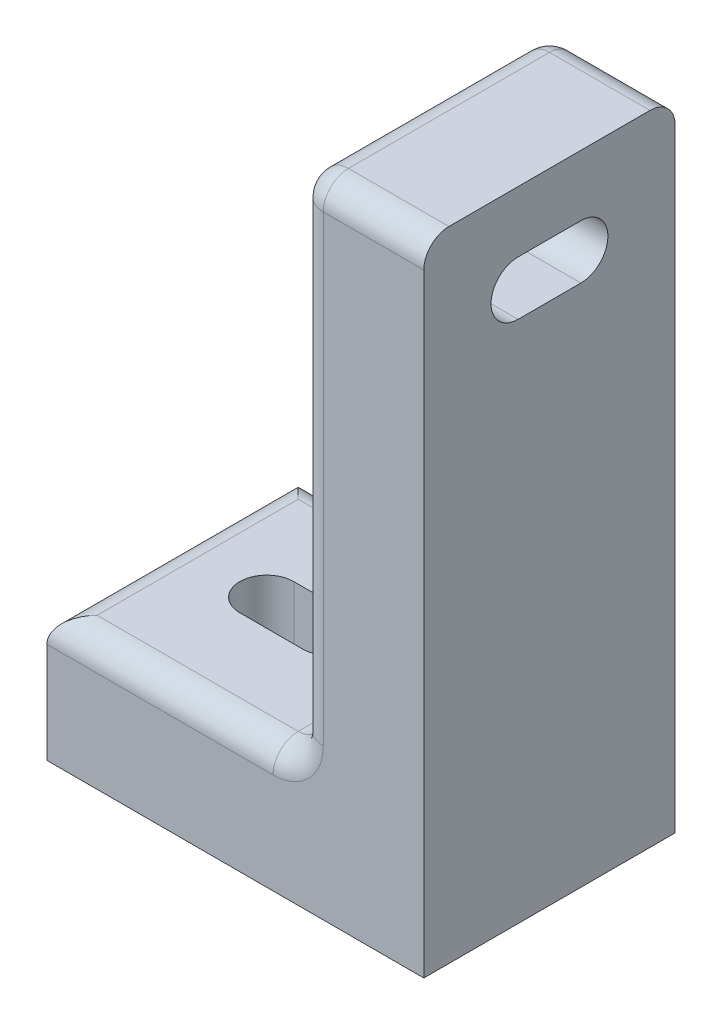
ISO-10303-21;
HEADER;
FILE_DESCRIPTION(('STEP AP214'),'2;1');
FILE_NAME('part.step','',(''),(''),'','','');
FILE_SCHEMA(('AUTOMOTIVE_DESIGN { 1 0 10303 214 1 1 1 1 }'));
ENDSEC;
DATA;
#1=APPLICATION_CONTEXT('core data for automotive mechanical design processes');
#2=APPLICATION_PROTOCOL_DEFINITION('international standard','automotive_design',2000,#1);
#3=PRODUCT_CONTEXT('',#1,'mechanical');
#4=PRODUCT('Part','Part','',(#3));
#5=PRODUCT_RELATED_PRODUCT_CATEGORY('part','',(#4));
#6=PRODUCT_DEFINITION_FORMATION('','',#4);
#7=PRODUCT_DEFINITION_CONTEXT('part definition',#1,'design');
#8=PRODUCT_DEFINITION('design','',#6,#7);
#9=PRODUCT_DEFINITION_SHAPE('','',#8);
#10=(LENGTH_UNIT() NAMED_UNIT(*) SI_UNIT(.MILLI.,.METRE.));
#11=(NAMED_UNIT(*) PLANE_ANGLE_UNIT() SI_UNIT($,.RADIAN.));
#12=(NAMED_UNIT(*) SI_UNIT($,.STERADIAN.) SOLID_ANGLE_UNIT());
#13=UNCERTAINTY_MEASURE_WITH_UNIT(LENGTH_MEASURE(1.E-05),#10,'distance_accuracy_value','');
#14=(GEOMETRIC_REPRESENTATION_CONTEXT(3) GLOBAL_UNCERTAINTY_ASSIGNED_CONTEXT((#13)) GLOBAL_UNIT_ASSIGNED_CONTEXT((#10,
#11,#12)) REPRESENTATION_CONTEXT('',''));
#15=CARTESIAN_POINT('',(0.,0.,0.));
#16=DIRECTION('',(0.,0.,1.));
#17=DIRECTION('',(1.,0.,0.));
#18=AXIS2_PLACEMENT_3D('',#15,#16,#17);
#19=CARTESIAN_POINT('',(0.,0.,20.));
#20=DIRECTION('',(-1.,0.,0.));
#21=DIRECTION('',(0.,0.,1.));
#22=AXIS2_PLACEMENT_3D('',#19,#20,#21);
#23=PLANE('',#22);
#24=DIRECTION('',(0.,0.,-1.));
#25=VECTOR('',#24,1.);
#26=CARTESIAN_POINT('',(0.,50.8,20.));
#27=LINE('',#26,#25);
#28=CARTESIAN_POINT('',(0.,50.8,18.));
#29=VERTEX_POINT('',#28);
#30=CARTESIAN_POINT('',(0.,50.8,2.));
#31=VERTEX_POINT('',#30);
#32=EDGE_CURVE('E509',#29,#31,#27,.T.);
#33=ORIENTED_EDGE('',*,*,#32,.F.);
#34=CARTESIAN_POINT('',(0.,48.8,18.));
#35=DIRECTION('',(-1.,0.,0.));
#36=DIRECTION('',(0.,0.,1.));
#37=AXIS2_PLACEMENT_3D('',#34,#35,#36);
#38=CIRCLE('',#37,2.);
#39=CARTESIAN_POINT('',(0.,48.8,20.));
#40=VERTEX_POINT('',#39);
#41=EDGE_CURVE('E277',#29,#40,#38,.F.);
#42=ORIENTED_EDGE('',*,*,#41,.T.);
#43=DIRECTION('',(0.,1.,0.));
#44=VECTOR('',#43,1.);
#45=CARTESIAN_POINT('',(0.,0.,20.));
#46=LINE('',#45,#44);
#47=CARTESIAN_POINT('',(0.,0.,20.));
#48=VERTEX_POINT('',#47);
#49=EDGE_CURVE('E505',#48,#40,#46,.T.);
#50=ORIENTED_EDGE('',*,*,#49,.F.);
#51=DIRECTION('',(0.,0.,-1.));
#52=VECTOR('',#51,1.);
#53=CARTESIAN_POINT('',(0.,0.,20.));
#54=LINE('',#53,#52);
#55=CARTESIAN_POINT('',(0.,0.,0.));
#56=VERTEX_POINT('',#55);
#57=EDGE_CURVE('E521',#48,#56,#54,.T.);
#58=ORIENTED_EDGE('',*,*,#57,.T.);
#59=DIRECTION('',(0.,1.,0.));
#60=VECTOR('',#59,1.);
#61=CARTESIAN_POINT('',(0.,0.,0.));
#62=LINE('',#61,#60);
#63=CARTESIAN_POINT('',(0.,48.8,0.));
#64=VERTEX_POINT('',#63);
#65=EDGE_CURVE('E502',#56,#64,#62,.T.);
#66=ORIENTED_EDGE('',*,*,#65,.T.);
#67=CARTESIAN_POINT('',(0.,48.8,2.));
#68=DIRECTION('',(-1.,0.,0.));
#69=DIRECTION('',(0.,0.,1.));
#70=AXIS2_PLACEMENT_3D('',#67,#68,#69);
#71=CIRCLE('',#70,2.);
#72=EDGE_CURVE('E601',#64,#31,#71,.F.);
#73=ORIENTED_EDGE('',*,*,#72,.T.);
#74=EDGE_LOOP('',(#33,#42,#50,#58,#66,#73));
#75=FACE_BOUND('',#74,.T.);
#76=DIRECTION('',(0.,0.,1.));
#77=VECTOR('',#76,1.);
#78=CARTESIAN_POINT('',(0.,45.95,20.));
#79=LINE('',#78,#77);
#80=CARTESIAN_POINT('',(0.,45.95,7.5));
#81=VERTEX_POINT('',#80);
#82=CARTESIAN_POINT('',(0.,45.95,12.5));
#83=VERTEX_POINT('',#82);
#84=EDGE_CURVE('E493',#81,#83,#79,.T.);
#85=ORIENTED_EDGE('',*,*,#84,.F.);
#86=CARTESIAN_POINT('',(0.,43.8,7.5));
#87=DIRECTION('',(-1.,0.,0.));
#88=DIRECTION('',(0.,0.,1.));
#89=AXIS2_PLACEMENT_3D('',#86,#87,#88);
#90=CIRCLE('',#89,2.15);
#91=CARTESIAN_POINT('',(0.,41.65,7.5));
#92=VERTEX_POINT('',#91);
#93=EDGE_CURVE('E481',#81,#92,#90,.T.);
#94=ORIENTED_EDGE('',*,*,#93,.T.);
#95=DIRECTION('',(0.,0.,1.));
#96=VECTOR('',#95,1.);
#97=CARTESIAN_POINT('',(0.,41.65,20.));
#98=LINE('',#97,#96);
#99=CARTESIAN_POINT('',(0.,41.65,12.5));
#100=VERTEX_POINT('',#99);
#101=EDGE_CURVE('E485',#92,#100,#98,.T.);
#102=ORIENTED_EDGE('',*,*,#101,.T.);
#103=CARTESIAN_POINT('',(0.,43.8,12.5));
#104=DIRECTION('',(-1.,0.,0.));
#105=DIRECTION('',(0.,0.,1.));
#106=AXIS2_PLACEMENT_3D('',#103,#104,#105);
#107=CIRCLE('',#106,2.15);
#108=EDGE_CURVE('E489',#100,#83,#107,.T.);
#109=ORIENTED_EDGE('',*,*,#108,.T.);
#110=EDGE_LOOP('',(#85,#94,#102,#109));
#111=FACE_BOUND('',#110,.T.);
#112=ADVANCED_FACE('F267',(#75,#111),#23,.F.);
#113=CARTESIAN_POINT('',(-10.,10.,20.));
#114=DIRECTION('',(0.,-1.,0.));
#115=DIRECTION('',(1.,0.,0.));
#116=AXIS2_PLACEMENT_3D('',#113,#114,#115);
#117=PLANE('',#116);
#118=DIRECTION('',(-1.,0.,0.));
#119=VECTOR('',#118,1.);
#120=CARTESIAN_POINT('',(-10.,10.,18.));
#121=LINE('',#120,#119);
#122=CARTESIAN_POINT('',(-28.,10.,18.));
#123=VERTEX_POINT('',#122);
#124=CARTESIAN_POINT('',(-12.,10.,18.));
#125=VERTEX_POINT('',#124);
#126=EDGE_CURVE('E587',#123,#125,#121,.F.);
#127=ORIENTED_EDGE('',*,*,#126,.T.);
#128=DIRECTION('',(0.,0.,-1.));
#129=VECTOR('',#128,1.);
#130=CARTESIAN_POINT('',(-12.,10.,20.));
#131=LINE('',#130,#129);
#132=CARTESIAN_POINT('',(-12.,10.,2.));
#133=VERTEX_POINT('',#132);
#134=EDGE_CURVE('E591',#125,#133,#131,.T.);
#135=ORIENTED_EDGE('',*,*,#134,.T.);
#136=DIRECTION('',(-1.,0.,0.));
#137=VECTOR('',#136,1.);
#138=CARTESIAN_POINT('',(-30.,10.,2.));
#139=LINE('',#138,#137);
#140=CARTESIAN_POINT('',(-28.,10.,2.));
#141=VERTEX_POINT('',#140);
#142=EDGE_CURVE('E584',#133,#141,#139,.T.);
#143=ORIENTED_EDGE('',*,*,#142,.T.);
#144=DIRECTION('',(0.,0.,-1.));
#145=VECTOR('',#144,1.);
#146=CARTESIAN_POINT('',(-28.,10.,20.));
#147=LINE('',#146,#145);
#148=EDGE_CURVE('E581',#141,#123,#147,.F.);
#149=ORIENTED_EDGE('',*,*,#148,.T.);
#150=EDGE_LOOP('',(#127,#135,#143,#149));
#151=FACE_BOUND('',#150,.T.);
#152=CARTESIAN_POINT('',(-22.5,10.,10.));
#153=DIRECTION('',(0.,1.,0.));
#154=DIRECTION('',(0.,0.,1.));
#155=AXIS2_PLACEMENT_3D('',#152,#153,#154);
#156=CIRCLE('',#155,2.15);
#157=CARTESIAN_POINT('',(-22.5,10.,7.85));
#158=VERTEX_POINT('',#157);
#159=CARTESIAN_POINT('',(-22.5,10.,12.15));
#160=VERTEX_POINT('',#159);
#161=EDGE_CURVE('E423',#158,#160,#156,.T.);
#162=ORIENTED_EDGE('',*,*,#161,.F.);
#163=DIRECTION('',(1.,0.,0.));
#164=VECTOR('',#163,1.);
#165=CARTESIAN_POINT('',(-22.5,10.,7.85));
#166=LINE('',#165,#164);
#167=CARTESIAN_POINT('',(-17.5,10.,7.85));
#168=VERTEX_POINT('',#167);
#169=EDGE_CURVE('E411',#158,#168,#166,.T.);
#170=ORIENTED_EDGE('',*,*,#169,.T.);
#171=CARTESIAN_POINT('',(-17.5,10.,10.));
#172=DIRECTION('',(0.,1.,0.));
#173=DIRECTION('',(0.,0.,1.));
#174=AXIS2_PLACEMENT_3D('',#171,#172,#173);
#175=CIRCLE('',#174,2.15);
#176=CARTESIAN_POINT('',(-17.5,10.,12.15));
#177=VERTEX_POINT('',#176);
#178=EDGE_CURVE('E434',#177,#168,#175,.T.);
#179=ORIENTED_EDGE('',*,*,#178,.F.);
#180=DIRECTION('',(1.,0.,0.));
#181=VECTOR('',#180,1.);
#182=CARTESIAN_POINT('',(-22.5,10.,12.15));
#183=LINE('',#182,#181);
#184=EDGE_CURVE('E424',#160,#177,#183,.T.);
#185=ORIENTED_EDGE('',*,*,#184,.F.);
#186=EDGE_LOOP('',(#162,#170,#179,#185));
#187=FACE_BOUND('',#186,.T.);
#188=ADVANCED_FACE('F438',(#151,#187),#117,.F.);
#189=CARTESIAN_POINT('',(-30.,0.,20.));
#190=DIRECTION('',(-1.,0.,0.));
#191=DIRECTION('',(0.,0.,1.));
#192=AXIS2_PLACEMENT_3D('',#189,#190,#191);
#193=PLANE('',#192);
#194=DIRECTION('',(0.,1.,0.));
#195=VECTOR('',#194,1.);
#196=CARTESIAN_POINT('',(-30.,0.,20.));
#197=LINE('',#196,#195);
#198=CARTESIAN_POINT('',(-30.,0.,20.));
#199=VERTEX_POINT('',#198);
#200=CARTESIAN_POINT('',(-30.,8.,20.));
#201=VERTEX_POINT('',#200);
#202=EDGE_CURVE('E497',#199,#201,#197,.T.);
#203=ORIENTED_EDGE('',*,*,#202,.T.);
#204=DIRECTION('',(0.,0.,-1.));
#205=VECTOR('',#204,1.);
#206=CARTESIAN_POINT('',(-30.,8.,0.));
#207=LINE('',#206,#205);
#208=CARTESIAN_POINT('',(-30.,8.,0.));
#209=VERTEX_POINT('',#208);
#210=EDGE_CURVE('E13',#201,#209,#207,.T.);
#211=ORIENTED_EDGE('',*,*,#210,.T.);
#212=DIRECTION('',(0.,1.,0.));
#213=VECTOR('',#212,1.);
#214=CARTESIAN_POINT('',(-30.,0.,0.));
#215=LINE('',#214,#213);
#216=CARTESIAN_POINT('',(-30.,0.,0.));
#217=VERTEX_POINT('',#216);
#218=EDGE_CURVE('E496',#217,#209,#215,.T.);
#219=ORIENTED_EDGE('',*,*,#218,.F.);
#220=DIRECTION('',(0.,0.,-1.));
#221=VECTOR('',#220,1.);
#222=CARTESIAN_POINT('',(-30.,0.,20.));
#223=LINE('',#222,#221);
#224=EDGE_CURVE('E525',#199,#217,#223,.T.);
#225=ORIENTED_EDGE('',*,*,#224,.F.);
#226=EDGE_LOOP('',(#203,#211,#219,#225));
#227=FACE_BOUND('',#226,.T.);
#228=ADVANCED_FACE('F673',(#227),#193,.T.);
#229=CARTESIAN_POINT('',(-30.,0.,20.));
#230=DIRECTION('',(0.,1.,0.));
#231=DIRECTION('',(0.,0.,1.));
#232=AXIS2_PLACEMENT_3D('',#229,#230,#231);
#233=PLANE('',#232);
#234=DIRECTION('',(1.,0.,0.));
#235=VECTOR('',#234,1.);
#236=CARTESIAN_POINT('',(-30.,0.,12.15));
#237=LINE('',#236,#235);
#238=CARTESIAN_POINT('',(-22.5,0.,12.15));
#239=VERTEX_POINT('',#238);
#240=CARTESIAN_POINT('',(-17.5,0.,12.15));
#241=VERTEX_POINT('',#240);
#242=EDGE_CURVE('E533',#239,#241,#237,.T.);
#243=ORIENTED_EDGE('',*,*,#242,.T.);
#244=CARTESIAN_POINT('',(-17.5,0.,10.));
#245=DIRECTION('',(0.,1.,0.));
#246=DIRECTION('',(0.,0.,1.));
#247=AXIS2_PLACEMENT_3D('',#244,#245,#246);
#248=CIRCLE('',#247,2.14999999999999);
#249=CARTESIAN_POINT('',(-17.5,0.,7.85000000000001));
#250=VERTEX_POINT('',#249);
#251=EDGE_CURVE('E537',#241,#250,#248,.T.);
#252=ORIENTED_EDGE('',*,*,#251,.T.);
#253=DIRECTION('',(-1.,0.,0.));
#254=VECTOR('',#253,1.);
#255=CARTESIAN_POINT('',(-30.,0.,7.85000000000001));
#256=LINE('',#255,#254);
#257=CARTESIAN_POINT('',(-22.5,0.,7.85000000000001));
#258=VERTEX_POINT('',#257);
#259=EDGE_CURVE('E528',#250,#258,#256,.T.);
#260=ORIENTED_EDGE('',*,*,#259,.T.);
#261=CARTESIAN_POINT('',(-22.5,0.,10.));
#262=DIRECTION('',(0.,1.,0.));
#263=DIRECTION('',(0.,0.,1.));
#264=AXIS2_PLACEMENT_3D('',#261,#262,#263);
#265=CIRCLE('',#264,2.14999999999999);
#266=EDGE_CURVE('E431',#258,#239,#265,.T.);
#267=ORIENTED_EDGE('',*,*,#266,.T.);
#268=EDGE_LOOP('',(#243,#252,#260,#267));
#269=FACE_BOUND('',#268,.T.);
#270=DIRECTION('',(1.,0.,0.));
#271=VECTOR('',#270,1.);
#272=CARTESIAN_POINT('',(-30.,0.,0.));
#273=LINE('',#272,#271);
#274=EDGE_CURVE('E513',#217,#56,#273,.T.);
#275=ORIENTED_EDGE('',*,*,#274,.T.);
#276=ORIENTED_EDGE('',*,*,#57,.F.);
#277=DIRECTION('',(1.,0.,0.));
#278=VECTOR('',#277,1.);
#279=CARTESIAN_POINT('',(-30.,0.,20.));
#280=LINE('',#279,#278);
#281=EDGE_CURVE('E501',#199,#48,#280,.T.);
#282=ORIENTED_EDGE('',*,*,#281,.F.);
#283=ORIENTED_EDGE('',*,*,#224,.T.);
#284=EDGE_LOOP('',(#275,#276,#282,#283));
#285=FACE_BOUND('',#284,.T.);
#286=ADVANCED_FACE('F669',(#269,#285),#233,.F.);
#287=CARTESIAN_POINT('',(-10.,50.8,20.));
#288=DIRECTION('',(0.,1.,0.));
#289=DIRECTION('',(0.,0.,1.));
#290=AXIS2_PLACEMENT_3D('',#287,#288,#289);
#291=PLANE('',#290);
#292=DIRECTION('',(0.,0.,-1.));
#293=VECTOR('',#292,1.);
#294=CARTESIAN_POINT('',(-8.,50.8,20.));
#295=LINE('',#294,#293);
#296=CARTESIAN_POINT('',(-8.,50.8,2.));
#297=VERTEX_POINT('',#296);
#298=CARTESIAN_POINT('',(-8.,50.8,18.));
#299=VERTEX_POINT('',#298);
#300=EDGE_CURVE('E285',#297,#299,#295,.F.);
#301=ORIENTED_EDGE('',*,*,#300,.T.);
#302=DIRECTION('',(1.,0.,0.));
#303=VECTOR('',#302,1.);
#304=CARTESIAN_POINT('',(0.,50.8,18.));
#305=LINE('',#304,#303);
#306=EDGE_CURVE('E598',#299,#29,#305,.T.);
#307=ORIENTED_EDGE('',*,*,#306,.T.);
#308=ORIENTED_EDGE('',*,*,#32,.T.);
#309=DIRECTION('',(1.,0.,0.));
#310=VECTOR('',#309,1.);
#311=CARTESIAN_POINT('',(-10.,50.8,2.));
#312=LINE('',#311,#310);
#313=EDGE_CURVE('E290',#31,#297,#312,.F.);
#314=ORIENTED_EDGE('',*,*,#313,.T.);
#315=EDGE_LOOP('',(#301,#307,#308,#314));
#316=FACE_BOUND('',#315,.T.);
#317=ADVANCED_FACE('F672',(#316),#291,.T.);
#318=CARTESIAN_POINT('',(-10.,10.,20.));
#319=DIRECTION('',(-1.,0.,0.));
#320=DIRECTION('',(0.,0.,1.));
#321=AXIS2_PLACEMENT_3D('',#318,#319,#320);
#322=PLANE('',#321);
#323=DIRECTION('',(0.,1.,0.));
#324=VECTOR('',#323,1.);
#325=CARTESIAN_POINT('',(-10.,50.8,18.));
#326=LINE('',#325,#324);
#327=CARTESIAN_POINT('',(-10.,12.,18.));
#328=VERTEX_POINT('',#327);
#329=CARTESIAN_POINT('',(-10.,48.8,18.));
#330=VERTEX_POINT('',#329);
#331=EDGE_CURVE('E547',#328,#330,#326,.T.);
#332=ORIENTED_EDGE('',*,*,#331,.T.);
#333=DIRECTION('',(0.,0.,-1.));
#334=VECTOR('',#333,1.);
#335=CARTESIAN_POINT('',(-10.,48.8,20.));
#336=LINE('',#335,#334);
#337=CARTESIAN_POINT('',(-10.,48.8,2.));
#338=VERTEX_POINT('',#337);
#339=EDGE_CURVE('E551',#330,#338,#336,.T.);
#340=ORIENTED_EDGE('',*,*,#339,.T.);
#341=DIRECTION('',(0.,1.,0.));
#342=VECTOR('',#341,1.);
#343=CARTESIAN_POINT('',(-10.,10.,2.));
#344=LINE('',#343,#342);
#345=CARTESIAN_POINT('',(-10.,12.,2.));
#346=VERTEX_POINT('',#345);
#347=EDGE_CURVE('E544',#338,#346,#344,.F.);
#348=ORIENTED_EDGE('',*,*,#347,.T.);
#349=DIRECTION('',(0.,0.,-1.));
#350=VECTOR('',#349,1.);
#351=CARTESIAN_POINT('',(-10.,12.,20.));
#352=LINE('',#351,#350);
#353=EDGE_CURVE('E541',#346,#328,#352,.F.);
#354=ORIENTED_EDGE('',*,*,#353,.T.);
#355=EDGE_LOOP('',(#332,#340,#348,#354));
#356=FACE_BOUND('',#355,.T.);
#357=DIRECTION('',(0.,0.,1.));
#358=VECTOR('',#357,1.);
#359=CARTESIAN_POINT('',(-10.,41.65,7.5));
#360=LINE('',#359,#358);
#361=CARTESIAN_POINT('',(-10.,41.65,7.5));
#362=VERTEX_POINT('',#361);
#363=CARTESIAN_POINT('',(-10.,41.65,12.5));
#364=VERTEX_POINT('',#363);
#365=EDGE_CURVE('E453',#362,#364,#360,.T.);
#366=ORIENTED_EDGE('',*,*,#365,.F.);
#367=CARTESIAN_POINT('',(-10.,43.8,7.5));
#368=DIRECTION('',(-1.,0.,0.));
#369=DIRECTION('',(0.,0.,1.));
#370=AXIS2_PLACEMENT_3D('',#367,#368,#369);
#371=CIRCLE('',#370,2.15);
#372=CARTESIAN_POINT('',(-10.,45.95,7.5));
#373=VERTEX_POINT('',#372);
#374=EDGE_CURVE('E464',#373,#362,#371,.T.);
#375=ORIENTED_EDGE('',*,*,#374,.F.);
#376=DIRECTION('',(0.,0.,1.));
#377=VECTOR('',#376,1.);
#378=CARTESIAN_POINT('',(-10.,45.95,7.5));
#379=LINE('',#378,#377);
#380=CARTESIAN_POINT('',(-10.,45.95,12.5));
#381=VERTEX_POINT('',#380);
#382=EDGE_CURVE('E456',#373,#381,#379,.T.);
#383=ORIENTED_EDGE('',*,*,#382,.T.);
#384=CARTESIAN_POINT('',(-10.,43.8,12.5));
#385=DIRECTION('',(-1.,0.,0.));
#386=DIRECTION('',(0.,0.,1.));
#387=AXIS2_PLACEMENT_3D('',#384,#385,#386);
#388=CIRCLE('',#387,2.15);
#389=EDGE_CURVE('E475',#364,#381,#388,.T.);
#390=ORIENTED_EDGE('',*,*,#389,.F.);
#391=EDGE_LOOP('',(#366,#375,#383,#390));
#392=FACE_BOUND('',#391,.T.);
#393=ADVANCED_FACE('F738',(#356,#392),#322,.T.);
#394=CARTESIAN_POINT('',(0.,0.,20.));
#395=DIRECTION('',(0.,0.,-1.));
#396=DIRECTION('',(-1.,0.,0.));
#397=AXIS2_PLACEMENT_3D('',#394,#395,#396);
#398=PLANE('',#397);
#399=CARTESIAN_POINT('',(-12.,12.,20.));
#400=DIRECTION('',(0.,0.,-1.));
#401=DIRECTION('',(-1.,0.,0.));
#402=AXIS2_PLACEMENT_3D('',#399,#400,#401);
#403=CIRCLE('',#402,4.);
#404=CARTESIAN_POINT('',(-12.,8.,20.));
#405=VERTEX_POINT('',#404);
#406=CARTESIAN_POINT('',(-8.,12.,20.));
#407=VERTEX_POINT('',#406);
#408=EDGE_CURVE('E561',#405,#407,#403,.F.);
#409=ORIENTED_EDGE('',*,*,#408,.F.);
#410=DIRECTION('',(-1.,0.,0.));
#411=VECTOR('',#410,1.);
#412=CARTESIAN_POINT('',(0.,8.,20.));
#413=LINE('',#412,#411);
#414=EDGE_CURVE('E565',#405,#201,#413,.T.);
#415=ORIENTED_EDGE('',*,*,#414,.T.);
#416=ORIENTED_EDGE('',*,*,#202,.F.);
#417=ORIENTED_EDGE('',*,*,#281,.T.);
#418=ORIENTED_EDGE('',*,*,#49,.T.);
#419=DIRECTION('',(1.,0.,0.));
#420=VECTOR('',#419,1.);
#421=CARTESIAN_POINT('',(-10.,48.8,20.));
#422=LINE('',#421,#420);
#423=CARTESIAN_POINT('',(-8.,48.8,20.));
#424=VERTEX_POINT('',#423);
#425=EDGE_CURVE('E554',#40,#424,#422,.F.);
#426=ORIENTED_EDGE('',*,*,#425,.T.);
#427=DIRECTION('',(0.,1.,0.));
#428=VECTOR('',#427,1.);
#429=CARTESIAN_POINT('',(-8.,10.,20.));
#430=LINE('',#429,#428);
#431=EDGE_CURVE('E557',#424,#407,#430,.F.);
#432=ORIENTED_EDGE('',*,*,#431,.T.);
#433=EDGE_LOOP('',(#409,#415,#416,#417,#418,#426,#432));
#434=FACE_BOUND('',#433,.T.);
#435=ADVANCED_FACE('F717',(#434),#398,.F.);
#436=CARTESIAN_POINT('',(0.,0.,0.));
#437=DIRECTION('',(0.,0.,-1.));
#438=DIRECTION('',(-1.,0.,0.));
#439=AXIS2_PLACEMENT_3D('',#436,#437,#438);
#440=PLANE('',#439);
#441=ORIENTED_EDGE('',*,*,#218,.T.);
#442=DIRECTION('',(-1.,0.,0.));
#443=VECTOR('',#442,1.);
#444=CARTESIAN_POINT('',(-10.,8.,0.));
#445=LINE('',#444,#443);
#446=CARTESIAN_POINT('',(-12.,8.,0.));
#447=VERTEX_POINT('',#446);
#448=EDGE_CURVE('E578',#209,#447,#445,.F.);
#449=ORIENTED_EDGE('',*,*,#448,.T.);
#450=CARTESIAN_POINT('',(-12.,12.,0.));
#451=DIRECTION('',(0.,0.,-1.));
#452=DIRECTION('',(-1.,0.,0.));
#453=AXIS2_PLACEMENT_3D('',#450,#451,#452);
#454=CIRCLE('',#453,4.);
#455=CARTESIAN_POINT('',(-8.,12.,0.));
#456=VERTEX_POINT('',#455);
#457=EDGE_CURVE('E574',#456,#447,#454,.T.);
#458=ORIENTED_EDGE('',*,*,#457,.F.);
#459=DIRECTION('',(0.,1.,0.));
#460=VECTOR('',#459,1.);
#461=CARTESIAN_POINT('',(-8.,0.,0.));
#462=LINE('',#461,#460);
#463=CARTESIAN_POINT('',(-8.,48.8,0.));
#464=VERTEX_POINT('',#463);
#465=EDGE_CURVE('E571',#456,#464,#462,.T.);
#466=ORIENTED_EDGE('',*,*,#465,.T.);
#467=DIRECTION('',(1.,0.,0.));
#468=VECTOR('',#467,1.);
#469=CARTESIAN_POINT('',(0.,48.8,0.));
#470=LINE('',#469,#468);
#471=EDGE_CURVE('E568',#464,#64,#470,.T.);
#472=ORIENTED_EDGE('',*,*,#471,.T.);
#473=ORIENTED_EDGE('',*,*,#65,.F.);
#474=ORIENTED_EDGE('',*,*,#274,.F.);
#475=EDGE_LOOP('',(#441,#449,#458,#466,#472,#473,#474));
#476=FACE_BOUND('',#475,.T.);
#477=ADVANCED_FACE('F686',(#476),#440,.T.);
#478=CARTESIAN_POINT('',(14.5,45.95,7.5));
#479=DIRECTION('',(0.,-1.,0.));
#480=DIRECTION('',(1.,0.,0.));
#481=AXIS2_PLACEMENT_3D('',#478,#479,#480);
#482=PLANE('',#481);
#483=ORIENTED_EDGE('',*,*,#84,.T.);
#484=DIRECTION('',(1.,0.,0.));
#485=VECTOR('',#484,1.);
#486=CARTESIAN_POINT('',(14.5,45.95,12.5));
#487=LINE('',#486,#485);
#488=EDGE_CURVE('E471',#381,#83,#487,.T.);
#489=ORIENTED_EDGE('',*,*,#488,.F.);
#490=ORIENTED_EDGE('',*,*,#382,.F.);
#491=DIRECTION('',(1.,0.,0.));
#492=VECTOR('',#491,1.);
#493=CARTESIAN_POINT('',(14.5,45.95,7.5));
#494=LINE('',#493,#492);
#495=EDGE_CURVE('E460',#373,#81,#494,.T.);
#496=ORIENTED_EDGE('',*,*,#495,.T.);
#497=EDGE_LOOP('',(#483,#489,#490,#496));
#498=FACE_BOUND('',#497,.T.);
#499=ADVANCED_FACE('F758',(#498),#482,.T.);
#500=CARTESIAN_POINT('',(-10.,43.8,12.5));
#501=DIRECTION('',(-1.,0.,0.));
#502=DIRECTION('',(0.,0.,1.));
#503=AXIS2_PLACEMENT_3D('',#500,#501,#502);
#504=CYLINDRICAL_SURFACE('',#503,2.15);
#505=DIRECTION('',(-1.,0.,0.));
#506=VECTOR('',#505,1.);
#507=CARTESIAN_POINT('',(-10.,41.65,12.5));
#508=LINE('',#507,#506);
#509=EDGE_CURVE('E478',#364,#100,#508,.F.);
#510=ORIENTED_EDGE('',*,*,#509,.F.);
#511=ORIENTED_EDGE('',*,*,#389,.T.);
#512=ORIENTED_EDGE('',*,*,#488,.T.);
#513=ORIENTED_EDGE('',*,*,#108,.F.);
#514=EDGE_LOOP('',(#510,#511,#512,#513));
#515=FACE_BOUND('',#514,.T.);
#516=ADVANCED_FACE('F751',(#515),#504,.F.);
#517=CARTESIAN_POINT('',(-10.,41.65,7.5));
#518=DIRECTION('',(0.,-1.,0.));
#519=DIRECTION('',(0.,0.,-1.));
#520=AXIS2_PLACEMENT_3D('',#517,#518,#519);
#521=PLANE('',#520);
#522=DIRECTION('',(-1.,0.,0.));
#523=VECTOR('',#522,1.);
#524=CARTESIAN_POINT('',(-10.,41.65,7.5));
#525=LINE('',#524,#523);
#526=EDGE_CURVE('E468',#92,#362,#525,.T.);
#527=ORIENTED_EDGE('',*,*,#526,.T.);
#528=ORIENTED_EDGE('',*,*,#365,.T.);
#529=ORIENTED_EDGE('',*,*,#509,.T.);
#530=ORIENTED_EDGE('',*,*,#101,.F.);
#531=EDGE_LOOP('',(#527,#528,#529,#530));
#532=FACE_BOUND('',#531,.T.);
#533=ADVANCED_FACE('F747',(#532),#521,.F.);
#534=CARTESIAN_POINT('',(-10.,43.8,7.5));
#535=DIRECTION('',(-1.,0.,0.));
#536=DIRECTION('',(0.,0.,1.));
#537=AXIS2_PLACEMENT_3D('',#534,#535,#536);
#538=CYLINDRICAL_SURFACE('',#537,2.15);
#539=ORIENTED_EDGE('',*,*,#495,.F.);
#540=ORIENTED_EDGE('',*,*,#374,.T.);
#541=ORIENTED_EDGE('',*,*,#526,.F.);
#542=ORIENTED_EDGE('',*,*,#93,.F.);
#543=EDGE_LOOP('',(#539,#540,#541,#542));
#544=FACE_BOUND('',#543,.T.);
#545=ADVANCED_FACE('F755',(#544),#538,.F.);
#546=CARTESIAN_POINT('',(-17.5,10.,10.));
#547=DIRECTION('',(0.,1.,0.));
#548=DIRECTION('',(0.,0.,1.));
#549=AXIS2_PLACEMENT_3D('',#546,#547,#548);
#550=CYLINDRICAL_SURFACE('',#549,2.14999999999999);
#551=DIRECTION('',(0.,1.,0.));
#552=VECTOR('',#551,1.);
#553=CARTESIAN_POINT('',(-17.5,10.,12.15));
#554=LINE('',#553,#552);
#555=EDGE_CURVE('E449',#177,#241,#554,.F.);
#556=ORIENTED_EDGE('',*,*,#555,.F.);
#557=ORIENTED_EDGE('',*,*,#178,.T.);
#558=DIRECTION('',(0.,1.,0.));
#559=VECTOR('',#558,1.);
#560=CARTESIAN_POINT('',(-17.5,10.,7.85000000000001));
#561=LINE('',#560,#559);
#562=EDGE_CURVE('E417',#250,#168,#561,.T.);
#563=ORIENTED_EDGE('',*,*,#562,.F.);
#564=ORIENTED_EDGE('',*,*,#251,.F.);
#565=EDGE_LOOP('',(#556,#557,#563,#564));
#566=FACE_BOUND('',#565,.T.);
#567=ADVANCED_FACE('F667',(#566),#550,.F.);
#568=CARTESIAN_POINT('',(-22.5,10.,12.15));
#569=DIRECTION('',(0.,0.,1.));
#570=DIRECTION('',(1.,0.,0.));
#571=AXIS2_PLACEMENT_3D('',#568,#569,#570);
#572=PLANE('',#571);
#573=DIRECTION('',(0.,1.,0.));
#574=VECTOR('',#573,1.);
#575=CARTESIAN_POINT('',(-22.5,10.,12.15));
#576=LINE('',#575,#574);
#577=EDGE_CURVE('E435',#239,#160,#576,.T.);
#578=ORIENTED_EDGE('',*,*,#577,.T.);
#579=ORIENTED_EDGE('',*,*,#184,.T.);
#580=ORIENTED_EDGE('',*,*,#555,.T.);
#581=ORIENTED_EDGE('',*,*,#242,.F.);
#582=EDGE_LOOP('',(#578,#579,#580,#581));
#583=FACE_BOUND('',#582,.T.);
#584=ADVANCED_FACE('F665',(#583),#572,.F.);
#585=CARTESIAN_POINT('',(-22.5,10.,10.));
#586=DIRECTION('',(0.,1.,0.));
#587=DIRECTION('',(0.,0.,1.));
#588=AXIS2_PLACEMENT_3D('',#585,#586,#587);
#589=CYLINDRICAL_SURFACE('',#588,2.14999999999999);
#590=DIRECTION('',(0.,1.,0.));
#591=VECTOR('',#590,1.);
#592=CARTESIAN_POINT('',(-22.5,10.,7.85000000000001));
#593=LINE('',#592,#591);
#594=EDGE_CURVE('E414',#158,#258,#593,.F.);
#595=ORIENTED_EDGE('',*,*,#594,.F.);
#596=ORIENTED_EDGE('',*,*,#161,.T.);
#597=ORIENTED_EDGE('',*,*,#577,.F.);
#598=ORIENTED_EDGE('',*,*,#266,.F.);
#599=EDGE_LOOP('',(#595,#596,#597,#598));
#600=FACE_BOUND('',#599,.T.);
#601=ADVANCED_FACE('F427',(#600),#589,.F.);
#602=CARTESIAN_POINT('',(-22.5,10.,7.85000000000001));
#603=DIRECTION('',(0.,0.,-1.));
#604=DIRECTION('',(-1.,0.,0.));
#605=AXIS2_PLACEMENT_3D('',#602,#603,#604);
#606=PLANE('',#605);
#607=ORIENTED_EDGE('',*,*,#562,.T.);
#608=ORIENTED_EDGE('',*,*,#169,.F.);
#609=ORIENTED_EDGE('',*,*,#594,.T.);
#610=ORIENTED_EDGE('',*,*,#259,.F.);
#611=EDGE_LOOP('',(#607,#608,#609,#610));
#612=FACE_BOUND('',#611,.T.);
#613=ADVANCED_FACE('F413',(#612),#606,.F.);
#614=CARTESIAN_POINT('',(-10.,8.,2.));
#615=DIRECTION('',(1.,0.,0.));
#616=DIRECTION('',(0.,1.,0.));
#617=AXIS2_PLACEMENT_3D('',#614,#615,#616);
#618=CYLINDRICAL_SURFACE('',#617,2.);
#619=CARTESIAN_POINT('',(-12.,8.,2.));
#620=DIRECTION('',(1.,0.,0.));
#621=DIRECTION('',(0.,0.,-1.));
#622=AXIS2_PLACEMENT_3D('',#619,#620,#621);
#623=CIRCLE('',#622,2.);
#624=EDGE_CURVE('E650',#447,#133,#623,.T.);
#625=ORIENTED_EDGE('',*,*,#624,.F.);
#626=ORIENTED_EDGE('',*,*,#448,.F.);
#627=CARTESIAN_POINT('',(-28.,8.,2.));
#628=DIRECTION('',(-0.707106781186547,0.,0.707106781186547));
#629=DIRECTION('',(0.707106781186547,0.,0.707106781186547));
#630=AXIS2_PLACEMENT_3D('',#627,#628,#629);
#631=ELLIPSE('',#630,2.82842712474619,2.);
#632=EDGE_CURVE('E271',#141,#209,#631,.T.);
#633=ORIENTED_EDGE('',*,*,#632,.F.);
#634=ORIENTED_EDGE('',*,*,#142,.F.);
#635=EDGE_LOOP('',(#625,#626,#633,#634));
#636=FACE_BOUND('',#635,.T.);
#637=ADVANCED_FACE('F269',(#636),#618,.T.);
#638=CARTESIAN_POINT('',(-8.,0.,2.));
#639=DIRECTION('',(0.,1.,0.));
#640=DIRECTION('',(0.,0.,1.));
#641=AXIS2_PLACEMENT_3D('',#638,#639,#640);
#642=CYLINDRICAL_SURFACE('',#641,2.);
#643=CARTESIAN_POINT('',(-8.,48.8,2.));
#644=DIRECTION('',(0.,1.,0.));
#645=DIRECTION('',(0.,0.,1.));
#646=AXIS2_PLACEMENT_3D('',#643,#644,#645);
#647=CIRCLE('',#646,2.);
#648=EDGE_CURVE('E643',#464,#338,#647,.T.);
#649=ORIENTED_EDGE('',*,*,#648,.F.);
#650=ORIENTED_EDGE('',*,*,#465,.F.);
#651=CARTESIAN_POINT('',(-8.,12.,2.));
#652=DIRECTION('',(0.,-1.,0.));
#653=DIRECTION('',(0.,0.,-1.));
#654=AXIS2_PLACEMENT_3D('',#651,#652,#653);
#655=CIRCLE('',#654,2.);
#656=EDGE_CURVE('E647',#346,#456,#655,.T.);
#657=ORIENTED_EDGE('',*,*,#656,.F.);
#658=ORIENTED_EDGE('',*,*,#347,.F.);
#659=EDGE_LOOP('',(#649,#650,#657,#658));
#660=FACE_BOUND('',#659,.T.);
#661=ADVANCED_FACE('F695',(#660),#642,.T.);
#662=CARTESIAN_POINT('',(0.,48.8,2.));
#663=DIRECTION('',(1.,0.,0.));
#664=DIRECTION('',(0.,0.,-1.));
#665=AXIS2_PLACEMENT_3D('',#662,#663,#664);
#666=CYLINDRICAL_SURFACE('',#665,2.);
#667=ORIENTED_EDGE('',*,*,#72,.F.);
#668=ORIENTED_EDGE('',*,*,#471,.F.);
#669=CARTESIAN_POINT('',(-8.,48.8,2.));
#670=DIRECTION('',(-1.,0.,0.));
#671=DIRECTION('',(0.,0.,1.));
#672=AXIS2_PLACEMENT_3D('',#669,#670,#671);
#673=CIRCLE('',#672,2.);
#674=EDGE_CURVE('E639',#297,#464,#673,.T.);
#675=ORIENTED_EDGE('',*,*,#674,.F.);
#676=ORIENTED_EDGE('',*,*,#313,.F.);
#677=EDGE_LOOP('',(#667,#668,#675,#676));
#678=FACE_BOUND('',#677,.T.);
#679=ADVANCED_FACE('F691',(#678),#666,.T.);
#680=CARTESIAN_POINT('',(-28.,8.,20.));
#681=DIRECTION('',(0.,0.,1.));
#682=DIRECTION('',(1.,0.,0.));
#683=AXIS2_PLACEMENT_3D('',#680,#681,#682);
#684=CYLINDRICAL_SURFACE('',#683,2.);
#685=ORIENTED_EDGE('',*,*,#632,.T.);
#686=ORIENTED_EDGE('',*,*,#210,.F.);
#687=CARTESIAN_POINT('',(-28.,8.,18.));
#688=DIRECTION('',(0.707106781186547,0.,0.707106781186547));
#689=DIRECTION('',(-0.707106781186547,0.,0.707106781186547));
#690=AXIS2_PLACEMENT_3D('',#687,#688,#689);
#691=ELLIPSE('',#690,2.82842712474619,2.);
#692=EDGE_CURVE('E635',#123,#201,#691,.T.);
#693=ORIENTED_EDGE('',*,*,#692,.F.);
#694=ORIENTED_EDGE('',*,*,#148,.F.);
#695=EDGE_LOOP('',(#685,#686,#693,#694));
#696=FACE_BOUND('',#695,.T.);
#697=ADVANCED_FACE('F722',(#696),#684,.T.);
#698=CARTESIAN_POINT('',(-12.,12.,2.));
#699=DIRECTION('',(0.,0.,-1.));
#700=DIRECTION('',(-1.,0.,0.));
#701=AXIS2_PLACEMENT_3D('',#698,#699,#700);
#702=TOROIDAL_SURFACE('',#701,4.,2.);
#703=ORIENTED_EDGE('',*,*,#457,.T.);
#704=ORIENTED_EDGE('',*,*,#624,.T.);
#705=CARTESIAN_POINT('',(-12.,12.,2.));
#706=DIRECTION('',(0.,0.,-1.));
#707=DIRECTION('',(-1.,0.,0.));
#708=AXIS2_PLACEMENT_3D('',#705,#706,#707);
#709=CIRCLE('',#708,2.);
#710=EDGE_CURVE('E631',#346,#133,#709,.T.);
#711=ORIENTED_EDGE('',*,*,#710,.F.);
#712=ORIENTED_EDGE('',*,*,#656,.T.);
#713=EDGE_LOOP('',(#703,#704,#711,#712));
#714=FACE_BOUND('',#713,.T.);
#715=ADVANCED_FACE('F732',(#714),#702,.T.);
#716=CARTESIAN_POINT('',(-8.,48.8,2.));
#717=DIRECTION('',(0.,0.,-1.));
#718=DIRECTION('',(-1.,0.,0.));
#719=AXIS2_PLACEMENT_3D('',#716,#717,#718);
#720=SPHERICAL_SURFACE('',#719,2.);
#721=ORIENTED_EDGE('',*,*,#674,.T.);
#722=ORIENTED_EDGE('',*,*,#648,.T.);
#723=CARTESIAN_POINT('',(-8.,48.8,2.));
#724=DIRECTION('',(0.,0.,-1.));
#725=DIRECTION('',(-1.,0.,0.));
#726=AXIS2_PLACEMENT_3D('',#723,#724,#725);
#727=CIRCLE('',#726,2.);
#728=EDGE_CURVE('E627',#297,#338,#727,.F.);
#729=ORIENTED_EDGE('',*,*,#728,.F.);
#730=EDGE_LOOP('',(#721,#722,#729));
#731=FACE_BOUND('',#730,.T.);
#732=ADVANCED_FACE('F698',(#731),#720,.T.);
#733=CARTESIAN_POINT('',(0.,8.,18.));
#734=DIRECTION('',(-1.,0.,0.));
#735=DIRECTION('',(0.,-1.,0.));
#736=AXIS2_PLACEMENT_3D('',#733,#734,#735);
#737=CYLINDRICAL_SURFACE('',#736,2.);
#738=ORIENTED_EDGE('',*,*,#692,.T.);
#739=ORIENTED_EDGE('',*,*,#414,.F.);
#740=CARTESIAN_POINT('',(-12.,8.,18.));
#741=DIRECTION('',(1.,0.,0.));
#742=DIRECTION('',(0.,0.,-1.));
#743=AXIS2_PLACEMENT_3D('',#740,#741,#742);
#744=CIRCLE('',#743,2.);
#745=EDGE_CURVE('E623',#125,#405,#744,.T.);
#746=ORIENTED_EDGE('',*,*,#745,.F.);
#747=ORIENTED_EDGE('',*,*,#126,.F.);
#748=EDGE_LOOP('',(#738,#739,#746,#747));
#749=FACE_BOUND('',#748,.T.);
#750=ADVANCED_FACE('F725',(#749),#737,.T.);
#751=CARTESIAN_POINT('',(-12.,12.,20.));
#752=DIRECTION('',(0.,0.,-1.));
#753=DIRECTION('',(-1.,0.,0.));
#754=AXIS2_PLACEMENT_3D('',#751,#752,#753);
#755=CYLINDRICAL_SURFACE('',#754,2.);
#756=ORIENTED_EDGE('',*,*,#710,.T.);
#757=ORIENTED_EDGE('',*,*,#134,.F.);
#758=CARTESIAN_POINT('',(-12.,12.,18.));
#759=DIRECTION('',(0.,0.,-1.));
#760=DIRECTION('',(-1.,0.,0.));
#761=AXIS2_PLACEMENT_3D('',#758,#759,#760);
#762=CIRCLE('',#761,2.);
#763=EDGE_CURVE('E620',#328,#125,#762,.T.);
#764=ORIENTED_EDGE('',*,*,#763,.F.);
#765=ORIENTED_EDGE('',*,*,#353,.F.);
#766=EDGE_LOOP('',(#756,#757,#764,#765));
#767=FACE_BOUND('',#766,.T.);
#768=ADVANCED_FACE('F736',(#767),#755,.F.);
#769=CARTESIAN_POINT('',(-8.,48.8,20.));
#770=DIRECTION('',(0.,0.,-1.));
#771=DIRECTION('',(-1.,0.,0.));
#772=AXIS2_PLACEMENT_3D('',#769,#770,#771);
#773=CYLINDRICAL_SURFACE('',#772,2.);
#774=ORIENTED_EDGE('',*,*,#728,.T.);
#775=ORIENTED_EDGE('',*,*,#339,.F.);
#776=CARTESIAN_POINT('',(-8.,48.8,18.));
#777=DIRECTION('',(0.,0.,1.));
#778=DIRECTION('',(1.,0.,0.));
#779=AXIS2_PLACEMENT_3D('',#776,#777,#778);
#780=CIRCLE('',#779,2.);
#781=EDGE_CURVE('E616',#299,#330,#780,.T.);
#782=ORIENTED_EDGE('',*,*,#781,.F.);
#783=ORIENTED_EDGE('',*,*,#300,.F.);
#784=EDGE_LOOP('',(#774,#775,#782,#783));
#785=FACE_BOUND('',#784,.T.);
#786=ADVANCED_FACE('F702',(#785),#773,.T.);
#787=CARTESIAN_POINT('',(-10.,48.8,18.));
#788=DIRECTION('',(-1.,0.,0.));
#789=DIRECTION('',(0.,0.,1.));
#790=AXIS2_PLACEMENT_3D('',#787,#788,#789);
#791=CYLINDRICAL_SURFACE('',#790,2.);
#792=ORIENTED_EDGE('',*,*,#41,.F.);
#793=ORIENTED_EDGE('',*,*,#306,.F.);
#794=CARTESIAN_POINT('',(-8.,48.8,18.));
#795=DIRECTION('',(-1.,0.,0.));
#796=DIRECTION('',(0.,0.,1.));
#797=AXIS2_PLACEMENT_3D('',#794,#795,#796);
#798=CIRCLE('',#797,2.);
#799=EDGE_CURVE('E612',#424,#299,#798,.T.);
#800=ORIENTED_EDGE('',*,*,#799,.F.);
#801=ORIENTED_EDGE('',*,*,#425,.F.);
#802=EDGE_LOOP('',(#792,#793,#800,#801));
#803=FACE_BOUND('',#802,.T.);
#804=ADVANCED_FACE('F711',(#803),#791,.T.);
#805=CARTESIAN_POINT('',(-12.,12.,18.));
#806=DIRECTION('',(0.,0.,-1.));
#807=DIRECTION('',(-1.,0.,0.));
#808=AXIS2_PLACEMENT_3D('',#805,#806,#807);
#809=TOROIDAL_SURFACE('',#808,4.,2.);
#810=ORIENTED_EDGE('',*,*,#745,.T.);
#811=ORIENTED_EDGE('',*,*,#408,.T.);
#812=CARTESIAN_POINT('',(-8.,12.,18.));
#813=DIRECTION('',(0.,-1.,0.));
#814=DIRECTION('',(0.,0.,-1.));
#815=AXIS2_PLACEMENT_3D('',#812,#813,#814);
#816=CIRCLE('',#815,2.);
#817=EDGE_CURVE('E609',#328,#407,#816,.F.);
#818=ORIENTED_EDGE('',*,*,#817,.F.);
#819=ORIENTED_EDGE('',*,*,#763,.T.);
#820=EDGE_LOOP('',(#810,#811,#818,#819));
#821=FACE_BOUND('',#820,.T.);
#822=ADVANCED_FACE('F784',(#821),#809,.T.);
#823=CARTESIAN_POINT('',(-8.,48.8,18.));
#824=DIRECTION('',(0.,1.,0.));
#825=DIRECTION('',(0.,0.,1.));
#826=AXIS2_PLACEMENT_3D('',#823,#824,#825);
#827=SPHERICAL_SURFACE('',#826,2.);
#828=ORIENTED_EDGE('',*,*,#799,.T.);
#829=ORIENTED_EDGE('',*,*,#781,.T.);
#830=CARTESIAN_POINT('',(-8.,48.8,18.));
#831=DIRECTION('',(0.,1.,0.));
#832=DIRECTION('',(0.,0.,1.));
#833=AXIS2_PLACEMENT_3D('',#830,#831,#832);
#834=CIRCLE('',#833,2.);
#835=EDGE_CURVE('E606',#424,#330,#834,.F.);
#836=ORIENTED_EDGE('',*,*,#835,.F.);
#837=EDGE_LOOP('',(#828,#829,#836));
#838=FACE_BOUND('',#837,.T.);
#839=ADVANCED_FACE('F706',(#838),#827,.T.);
#840=CARTESIAN_POINT('',(-8.,10.,18.));
#841=DIRECTION('',(0.,-1.,0.));
#842=DIRECTION('',(0.,0.,-1.));
#843=AXIS2_PLACEMENT_3D('',#840,#841,#842);
#844=CYLINDRICAL_SURFACE('',#843,2.);
#845=ORIENTED_EDGE('',*,*,#817,.T.);
#846=ORIENTED_EDGE('',*,*,#431,.F.);
#847=ORIENTED_EDGE('',*,*,#835,.T.);
#848=ORIENTED_EDGE('',*,*,#331,.F.);
#849=EDGE_LOOP('',(#845,#846,#847,#848));
#850=FACE_BOUND('',#849,.T.);
#851=ADVANCED_FACE('F713',(#850),#844,.T.);
#852=CLOSED_SHELL('',(#112,#188,#228,#286,#317,#393,#435,#477,#499,#516,#533,#545,#567,#584,
#601,#613,#637,#661,#679,#697,#715,#732,#750,#768,#786,#804,#822,#839,#851));
#853=MANIFOLD_SOLID_BREP('B2',#852);
#854=ADVANCED_BREP_SHAPE_REPRESENTATION('',(#18,#853),#14);
#855=SHAPE_DEFINITION_REPRESENTATION(#9,#854);
ENDSEC;
END-ISO-10303-21;
